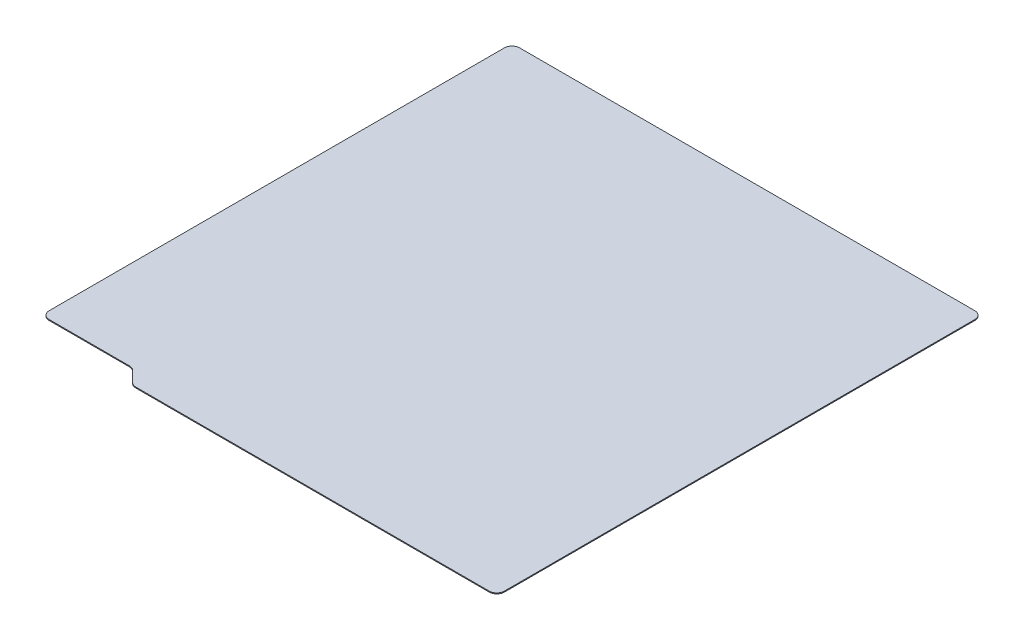
ISO-10303-21;
HEADER;
FILE_DESCRIPTION(('STEP AP214'),'2;1');
FILE_NAME('part.step','',(''),(''),'','','');
FILE_SCHEMA(('AUTOMOTIVE_DESIGN { 1 0 10303 214 1 1 1 1 }'));
ENDSEC;
DATA;
#1=APPLICATION_CONTEXT('core data for automotive mechanical design processes');
#2=APPLICATION_PROTOCOL_DEFINITION('international standard','automotive_design',2000,#1);
#3=PRODUCT_CONTEXT('',#1,'mechanical');
#4=PRODUCT('Part','Part','',(#3));
#5=PRODUCT_RELATED_PRODUCT_CATEGORY('part','',(#4));
#6=PRODUCT_DEFINITION_FORMATION('','',#4);
#7=PRODUCT_DEFINITION_CONTEXT('part definition',#1,'design');
#8=PRODUCT_DEFINITION('design','',#6,#7);
#9=PRODUCT_DEFINITION_SHAPE('','',#8);
#10=(LENGTH_UNIT() NAMED_UNIT(*) SI_UNIT(.MILLI.,.METRE.));
#11=(NAMED_UNIT(*) PLANE_ANGLE_UNIT() SI_UNIT($,.RADIAN.));
#12=(NAMED_UNIT(*) SI_UNIT($,.STERADIAN.) SOLID_ANGLE_UNIT());
#13=UNCERTAINTY_MEASURE_WITH_UNIT(LENGTH_MEASURE(1.E-05),#10,'distance_accuracy_value','');
#14=(GEOMETRIC_REPRESENTATION_CONTEXT(3) GLOBAL_UNCERTAINTY_ASSIGNED_CONTEXT((#13)) GLOBAL_UNIT_ASSIGNED_CONTEXT((#10,
#11,#12)) REPRESENTATION_CONTEXT('',''));
#15=CARTESIAN_POINT('',(0.,0.,0.));
#16=DIRECTION('',(0.,0.,1.));
#17=DIRECTION('',(1.,0.,0.));
#18=AXIS2_PLACEMENT_3D('',#15,#16,#17);
#19=CARTESIAN_POINT('',(-155.,0.6,155.));
#20=DIRECTION('',(1.,0.,0.));
#21=DIRECTION('',(0.,0.,-1.));
#22=AXIS2_PLACEMENT_3D('',#19,#20,#21);
#23=PLANE('',#22);
#24=DIRECTION('',(0.,0.,1.));
#25=VECTOR('',#24,1.);
#26=CARTESIAN_POINT('',(-155.,0.,155.));
#27=LINE('',#26,#25);
#28=CARTESIAN_POINT('',(-155.,0.,-150.));
#29=VERTEX_POINT('',#28);
#30=CARTESIAN_POINT('',(-155.,0.,150.));
#31=VERTEX_POINT('',#30);
#32=EDGE_CURVE('E192',#29,#31,#27,.T.);
#33=ORIENTED_EDGE('',*,*,#32,.T.);
#34=DIRECTION('',(0.,-1.,0.));
#35=VECTOR('',#34,1.);
#36=CARTESIAN_POINT('',(-155.,0.6,150.));
#37=LINE('',#36,#35);
#38=CARTESIAN_POINT('',(-155.,0.6,150.));
#39=VERTEX_POINT('',#38);
#40=EDGE_CURVE('E174',#31,#39,#37,.F.);
#41=ORIENTED_EDGE('',*,*,#40,.T.);
#42=DIRECTION('',(0.,0.,1.));
#43=VECTOR('',#42,1.);
#44=CARTESIAN_POINT('',(-155.,0.6,155.));
#45=LINE('',#44,#43);
#46=CARTESIAN_POINT('',(-155.,0.6,-150.));
#47=VERTEX_POINT('',#46);
#48=EDGE_CURVE('E135',#47,#39,#45,.T.);
#49=ORIENTED_EDGE('',*,*,#48,.F.);
#50=DIRECTION('',(0.,-1.,0.));
#51=VECTOR('',#50,1.);
#52=CARTESIAN_POINT('',(-155.,0.6,-150.));
#53=LINE('',#52,#51);
#54=EDGE_CURVE('E171',#47,#29,#53,.T.);
#55=ORIENTED_EDGE('',*,*,#54,.T.);
#56=EDGE_LOOP('',(#33,#41,#49,#55));
#57=FACE_BOUND('',#56,.T.);
#58=ADVANCED_FACE('F17',(#57),#23,.F.);
#59=CARTESIAN_POINT('',(-155.,0.6,155.));
#60=DIRECTION('',(0.,0.,-1.));
#61=DIRECTION('',(-1.,0.,0.));
#62=AXIS2_PLACEMENT_3D('',#59,#60,#61);
#63=PLANE('',#62);
#64=DIRECTION('',(1.,0.,0.));
#65=VECTOR('',#64,1.);
#66=CARTESIAN_POINT('',(-155.,0.,155.));
#67=LINE('',#66,#65);
#68=CARTESIAN_POINT('',(-150.,0.,155.));
#69=VERTEX_POINT('',#68);
#70=CARTESIAN_POINT('',(-97.0710678118654,0.,155.));
#71=VERTEX_POINT('',#70);
#72=EDGE_CURVE('E182',#69,#71,#67,.T.);
#73=ORIENTED_EDGE('',*,*,#72,.T.);
#74=DIRECTION('',(0.,-1.,0.));
#75=VECTOR('',#74,1.);
#76=CARTESIAN_POINT('',(-97.0710678118654,0.6,155.));
#77=LINE('',#76,#75);
#78=CARTESIAN_POINT('',(-97.0710678118654,0.6,155.));
#79=VERTEX_POINT('',#78);
#80=EDGE_CURVE('E169',#71,#79,#77,.F.);
#81=ORIENTED_EDGE('',*,*,#80,.T.);
#82=DIRECTION('',(1.,0.,0.));
#83=VECTOR('',#82,1.);
#84=CARTESIAN_POINT('',(-155.,0.6,155.));
#85=LINE('',#84,#83);
#86=CARTESIAN_POINT('',(-150.,0.6,155.));
#87=VERTEX_POINT('',#86);
#88=EDGE_CURVE('E202',#87,#79,#85,.T.);
#89=ORIENTED_EDGE('',*,*,#88,.F.);
#90=DIRECTION('',(0.,-1.,0.));
#91=VECTOR('',#90,1.);
#92=CARTESIAN_POINT('',(-150.,0.6,155.));
#93=LINE('',#92,#91);
#94=EDGE_CURVE('E166',#87,#69,#93,.T.);
#95=ORIENTED_EDGE('',*,*,#94,.T.);
#96=EDGE_LOOP('',(#73,#81,#89,#95));
#97=FACE_BOUND('',#96,.T.);
#98=ADVANCED_FACE('F188',(#97),#63,.F.);
#99=CARTESIAN_POINT('',(-95.,0.6,155.));
#100=DIRECTION('',(0.707106781186549,0.,-0.707106781186547));
#101=DIRECTION('',(-0.707106781186547,0.,-0.707106781186549));
#102=AXIS2_PLACEMENT_3D('',#99,#100,#101);
#103=PLANE('',#102);
#104=DIRECTION('',(0.707106781186547,0.,0.707106781186549));
#105=VECTOR('',#104,1.);
#106=CARTESIAN_POINT('',(-95.,0.,155.));
#107=LINE('',#106,#105);
#108=CARTESIAN_POINT('',(-93.5355339059327,0.,156.464466094067));
#109=VERTEX_POINT('',#108);
#110=CARTESIAN_POINT('',(-86.4644660940672,0.,163.535533905933));
#111=VERTEX_POINT('',#110);
#112=EDGE_CURVE('E137',#109,#111,#107,.T.);
#113=ORIENTED_EDGE('',*,*,#112,.T.);
#114=DIRECTION('',(0.,-1.,0.));
#115=VECTOR('',#114,1.);
#116=CARTESIAN_POINT('',(-86.4644660940672,0.6,163.535533905933));
#117=LINE('',#116,#115);
#118=CARTESIAN_POINT('',(-86.4644660940672,0.6,163.535533905933));
#119=VERTEX_POINT('',#118);
#120=EDGE_CURVE('E164',#111,#119,#117,.F.);
#121=ORIENTED_EDGE('',*,*,#120,.T.);
#122=DIRECTION('',(0.707106781186547,0.,0.707106781186549));
#123=VECTOR('',#122,1.);
#124=CARTESIAN_POINT('',(-95.,0.6,155.));
#125=LINE('',#124,#123);
#126=CARTESIAN_POINT('',(-93.5355339059327,0.6,156.464466094067));
#127=VERTEX_POINT('',#126);
#128=EDGE_CURVE('E200',#127,#119,#125,.T.);
#129=ORIENTED_EDGE('',*,*,#128,.F.);
#130=DIRECTION('',(0.,-1.,0.));
#131=VECTOR('',#130,1.);
#132=CARTESIAN_POINT('',(-93.5355339059327,0.,156.464466094067));
#133=LINE('',#132,#131);
#134=EDGE_CURVE('E161',#127,#109,#133,.T.);
#135=ORIENTED_EDGE('',*,*,#134,.T.);
#136=EDGE_LOOP('',(#113,#121,#129,#135));
#137=FACE_BOUND('',#136,.T.);
#138=ADVANCED_FACE('F204',(#137),#103,.F.);
#139=CARTESIAN_POINT('',(-85.,0.6,165.));
#140=DIRECTION('',(0.,0.,-1.));
#141=DIRECTION('',(-1.,0.,0.));
#142=AXIS2_PLACEMENT_3D('',#139,#140,#141);
#143=PLANE('',#142);
#144=DIRECTION('',(1.,0.,0.));
#145=VECTOR('',#144,1.);
#146=CARTESIAN_POINT('',(-85.,0.,165.));
#147=LINE('',#146,#145);
#148=CARTESIAN_POINT('',(-82.9289321881345,0.,165.));
#149=VERTEX_POINT('',#148);
#150=CARTESIAN_POINT('',(150.,0.,165.));
#151=VERTEX_POINT('',#150);
#152=EDGE_CURVE('E133',#149,#151,#147,.T.);
#153=ORIENTED_EDGE('',*,*,#152,.T.);
#154=DIRECTION('',(0.,-1.,0.));
#155=VECTOR('',#154,1.);
#156=CARTESIAN_POINT('',(150.,0.6,165.));
#157=LINE('',#156,#155);
#158=CARTESIAN_POINT('',(150.,0.6,165.));
#159=VERTEX_POINT('',#158);
#160=EDGE_CURVE('E112',#151,#159,#157,.F.);
#161=ORIENTED_EDGE('',*,*,#160,.T.);
#162=DIRECTION('',(1.,0.,0.));
#163=VECTOR('',#162,1.);
#164=CARTESIAN_POINT('',(-85.,0.6,165.));
#165=LINE('',#164,#163);
#166=CARTESIAN_POINT('',(-82.9289321881345,0.6,165.));
#167=VERTEX_POINT('',#166);
#168=EDGE_CURVE('E206',#167,#159,#165,.T.);
#169=ORIENTED_EDGE('',*,*,#168,.F.);
#170=DIRECTION('',(0.,-1.,0.));
#171=VECTOR('',#170,1.);
#172=CARTESIAN_POINT('',(-82.9289321881345,0.6,165.));
#173=LINE('',#172,#171);
#174=EDGE_CURVE('E117',#167,#149,#173,.T.);
#175=ORIENTED_EDGE('',*,*,#174,.T.);
#176=EDGE_LOOP('',(#153,#161,#169,#175));
#177=FACE_BOUND('',#176,.T.);
#178=ADVANCED_FACE('F220',(#177),#143,.F.);
#179=CARTESIAN_POINT('',(155.,0.6,155.));
#180=DIRECTION('',(-1.,0.,0.));
#181=DIRECTION('',(0.,0.,1.));
#182=AXIS2_PLACEMENT_3D('',#179,#180,#181);
#183=PLANE('',#182);
#184=DIRECTION('',(0.,0.,-1.));
#185=VECTOR('',#184,1.);
#186=CARTESIAN_POINT('',(155.,0.6,165.));
#187=LINE('',#186,#185);
#188=CARTESIAN_POINT('',(155.,0.6,160.));
#189=VERTEX_POINT('',#188);
#190=CARTESIAN_POINT('',(155.,0.6,-150.));
#191=VERTEX_POINT('',#190);
#192=EDGE_CURVE('E126',#189,#191,#187,.T.);
#193=ORIENTED_EDGE('',*,*,#192,.F.);
#194=DIRECTION('',(0.,-1.,0.));
#195=VECTOR('',#194,1.);
#196=CARTESIAN_POINT('',(155.,0.6,160.));
#197=LINE('',#196,#195);
#198=CARTESIAN_POINT('',(155.,0.,160.));
#199=VERTEX_POINT('',#198);
#200=EDGE_CURVE('E111',#189,#199,#197,.T.);
#201=ORIENTED_EDGE('',*,*,#200,.T.);
#202=DIRECTION('',(0.,0.,-1.));
#203=VECTOR('',#202,1.);
#204=CARTESIAN_POINT('',(155.,0.,155.));
#205=LINE('',#204,#203);
#206=CARTESIAN_POINT('',(155.,0.,-150.));
#207=VERTEX_POINT('',#206);
#208=EDGE_CURVE('E124',#199,#207,#205,.T.);
#209=ORIENTED_EDGE('',*,*,#208,.T.);
#210=DIRECTION('',(0.,-1.,0.));
#211=VECTOR('',#210,1.);
#212=CARTESIAN_POINT('',(155.,0.6,-150.));
#213=LINE('',#212,#211);
#214=EDGE_CURVE('E128',#207,#191,#213,.F.);
#215=ORIENTED_EDGE('',*,*,#214,.T.);
#216=EDGE_LOOP('',(#193,#201,#209,#215));
#217=FACE_BOUND('',#216,.T.);
#218=ADVANCED_FACE('F123',(#217),#183,.F.);
#219=CARTESIAN_POINT('',(155.,0.6,-155.));
#220=DIRECTION('',(0.,0.,1.));
#221=DIRECTION('',(1.,0.,0.));
#222=AXIS2_PLACEMENT_3D('',#219,#220,#221);
#223=PLANE('',#222);
#224=DIRECTION('',(-1.,0.,0.));
#225=VECTOR('',#224,1.);
#226=CARTESIAN_POINT('',(155.,0.,-155.));
#227=LINE('',#226,#225);
#228=CARTESIAN_POINT('',(150.,0.,-155.));
#229=VERTEX_POINT('',#228);
#230=CARTESIAN_POINT('',(-150.,0.,-155.));
#231=VERTEX_POINT('',#230);
#232=EDGE_CURVE('E132',#229,#231,#227,.T.);
#233=ORIENTED_EDGE('',*,*,#232,.T.);
#234=DIRECTION('',(0.,-1.,0.));
#235=VECTOR('',#234,1.);
#236=CARTESIAN_POINT('',(-150.,0.6,-155.));
#237=LINE('',#236,#235);
#238=CARTESIAN_POINT('',(-150.,0.6,-155.));
#239=VERTEX_POINT('',#238);
#240=EDGE_CURVE('E32',#231,#239,#237,.F.);
#241=ORIENTED_EDGE('',*,*,#240,.T.);
#242=DIRECTION('',(-1.,0.,0.));
#243=VECTOR('',#242,1.);
#244=CARTESIAN_POINT('',(155.,0.6,-155.));
#245=LINE('',#244,#243);
#246=CARTESIAN_POINT('',(150.,0.6,-155.));
#247=VERTEX_POINT('',#246);
#248=EDGE_CURVE('E141',#247,#239,#245,.T.);
#249=ORIENTED_EDGE('',*,*,#248,.F.);
#250=DIRECTION('',(0.,-1.,0.));
#251=VECTOR('',#250,1.);
#252=CARTESIAN_POINT('',(150.,0.6,-155.));
#253=LINE('',#252,#251);
#254=EDGE_CURVE('E176',#247,#229,#253,.T.);
#255=ORIENTED_EDGE('',*,*,#254,.T.);
#256=EDGE_LOOP('',(#233,#241,#249,#255));
#257=FACE_BOUND('',#256,.T.);
#258=ADVANCED_FACE('F229',(#257),#223,.F.);
#259=CARTESIAN_POINT('',(0.,0.6,0.));
#260=DIRECTION('',(0.,1.,0.));
#261=DIRECTION('',(0.,0.,1.));
#262=AXIS2_PLACEMENT_3D('',#259,#260,#261);
#263=PLANE('',#262);
#264=ORIENTED_EDGE('',*,*,#168,.T.);
#265=CARTESIAN_POINT('',(150.,0.6,160.));
#266=DIRECTION('',(0.,1.,0.));
#267=DIRECTION('',(0.,0.,1.));
#268=AXIS2_PLACEMENT_3D('',#265,#266,#267);
#269=CIRCLE('',#268,5.);
#270=EDGE_CURVE('E159',#159,#189,#269,.T.);
#271=ORIENTED_EDGE('',*,*,#270,.T.);
#272=ORIENTED_EDGE('',*,*,#192,.T.);
#273=CARTESIAN_POINT('',(150.,0.6,-150.));
#274=DIRECTION('',(0.,1.,0.));
#275=DIRECTION('',(0.,0.,1.));
#276=AXIS2_PLACEMENT_3D('',#273,#274,#275);
#277=CIRCLE('',#276,5.);
#278=EDGE_CURVE('E39',#191,#247,#277,.T.);
#279=ORIENTED_EDGE('',*,*,#278,.T.);
#280=ORIENTED_EDGE('',*,*,#248,.T.);
#281=CARTESIAN_POINT('',(-150.,0.6,-150.));
#282=DIRECTION('',(0.,1.,0.));
#283=DIRECTION('',(0.,0.,1.));
#284=AXIS2_PLACEMENT_3D('',#281,#282,#283);
#285=CIRCLE('',#284,5.);
#286=EDGE_CURVE('E153',#239,#47,#285,.T.);
#287=ORIENTED_EDGE('',*,*,#286,.T.);
#288=ORIENTED_EDGE('',*,*,#48,.T.);
#289=CARTESIAN_POINT('',(-150.,0.6,150.));
#290=DIRECTION('',(0.,1.,0.));
#291=DIRECTION('',(0.,0.,1.));
#292=AXIS2_PLACEMENT_3D('',#289,#290,#291);
#293=CIRCLE('',#292,5.);
#294=EDGE_CURVE('E155',#39,#87,#293,.T.);
#295=ORIENTED_EDGE('',*,*,#294,.T.);
#296=ORIENTED_EDGE('',*,*,#88,.T.);
#297=CARTESIAN_POINT('',(-97.0710678118654,0.6,160.));
#298=DIRECTION('',(0.,1.,0.));
#299=DIRECTION('',(0.,0.,1.));
#300=AXIS2_PLACEMENT_3D('',#297,#298,#299);
#301=CIRCLE('',#300,5.);
#302=EDGE_CURVE('E11',#79,#127,#301,.F.);
#303=ORIENTED_EDGE('',*,*,#302,.T.);
#304=ORIENTED_EDGE('',*,*,#128,.T.);
#305=CARTESIAN_POINT('',(-82.9289321881345,0.6,160.));
#306=DIRECTION('',(0.,1.,0.));
#307=DIRECTION('',(0.,0.,1.));
#308=AXIS2_PLACEMENT_3D('',#305,#306,#307);
#309=CIRCLE('',#308,5.);
#310=EDGE_CURVE('E157',#119,#167,#309,.T.);
#311=ORIENTED_EDGE('',*,*,#310,.T.);
#312=EDGE_LOOP('',(#264,#271,#272,#279,#280,#287,#288,#295,#296,#303,#304,#311));
#313=FACE_BOUND('',#312,.T.);
#314=ADVANCED_FACE('F199',(#313),#263,.T.);
#315=CARTESIAN_POINT('',(0.,0.,0.));
#316=DIRECTION('',(0.,1.,0.));
#317=DIRECTION('',(0.,0.,1.));
#318=AXIS2_PLACEMENT_3D('',#315,#316,#317);
#319=PLANE('',#318);
#320=ORIENTED_EDGE('',*,*,#208,.F.);
#321=CARTESIAN_POINT('',(150.,0.,160.));
#322=DIRECTION('',(0.,1.,0.));
#323=DIRECTION('',(0.,0.,1.));
#324=AXIS2_PLACEMENT_3D('',#321,#322,#323);
#325=CIRCLE('',#324,5.);
#326=EDGE_CURVE('E107',#199,#151,#325,.F.);
#327=ORIENTED_EDGE('',*,*,#326,.T.);
#328=ORIENTED_EDGE('',*,*,#152,.F.);
#329=CARTESIAN_POINT('',(-82.9289321881345,0.,160.));
#330=DIRECTION('',(0.,1.,0.));
#331=DIRECTION('',(0.,0.,1.));
#332=AXIS2_PLACEMENT_3D('',#329,#330,#331);
#333=CIRCLE('',#332,5.);
#334=EDGE_CURVE('E118',#149,#111,#333,.F.);
#335=ORIENTED_EDGE('',*,*,#334,.T.);
#336=ORIENTED_EDGE('',*,*,#112,.F.);
#337=CARTESIAN_POINT('',(-97.0710678118654,0.,160.));
#338=DIRECTION('',(0.,1.,0.));
#339=DIRECTION('',(0.,0.,1.));
#340=AXIS2_PLACEMENT_3D('',#337,#338,#339);
#341=CIRCLE('',#340,5.);
#342=EDGE_CURVE('E25',#109,#71,#341,.T.);
#343=ORIENTED_EDGE('',*,*,#342,.T.);
#344=ORIENTED_EDGE('',*,*,#72,.F.);
#345=CARTESIAN_POINT('',(-150.,0.,150.));
#346=DIRECTION('',(0.,1.,0.));
#347=DIRECTION('',(0.,0.,1.));
#348=AXIS2_PLACEMENT_3D('',#345,#346,#347);
#349=CIRCLE('',#348,5.);
#350=EDGE_CURVE('E146',#69,#31,#349,.F.);
#351=ORIENTED_EDGE('',*,*,#350,.T.);
#352=ORIENTED_EDGE('',*,*,#32,.F.);
#353=CARTESIAN_POINT('',(-150.,0.,-150.));
#354=DIRECTION('',(0.,1.,0.));
#355=DIRECTION('',(0.,0.,1.));
#356=AXIS2_PLACEMENT_3D('',#353,#354,#355);
#357=CIRCLE('',#356,5.);
#358=EDGE_CURVE('E144',#29,#231,#357,.F.);
#359=ORIENTED_EDGE('',*,*,#358,.T.);
#360=ORIENTED_EDGE('',*,*,#232,.F.);
#361=CARTESIAN_POINT('',(150.,0.,-150.));
#362=DIRECTION('',(0.,1.,0.));
#363=DIRECTION('',(0.,0.,1.));
#364=AXIS2_PLACEMENT_3D('',#361,#362,#363);
#365=CIRCLE('',#364,5.);
#366=EDGE_CURVE('E127',#229,#207,#365,.F.);
#367=ORIENTED_EDGE('',*,*,#366,.T.);
#368=EDGE_LOOP('',(#320,#327,#328,#335,#336,#343,#344,#351,#352,#359,#360,#367));
#369=FACE_BOUND('',#368,.T.);
#370=ADVANCED_FACE('F130',(#369),#319,.F.);
#371=CARTESIAN_POINT('',(150.,0.6,160.));
#372=DIRECTION('',(0.,-1.,0.));
#373=DIRECTION('',(0.,0.,-1.));
#374=AXIS2_PLACEMENT_3D('',#371,#372,#373);
#375=CYLINDRICAL_SURFACE('',#374,5.);
#376=ORIENTED_EDGE('',*,*,#270,.F.);
#377=ORIENTED_EDGE('',*,*,#160,.F.);
#378=ORIENTED_EDGE('',*,*,#326,.F.);
#379=ORIENTED_EDGE('',*,*,#200,.F.);
#380=EDGE_LOOP('',(#376,#377,#378,#379));
#381=FACE_BOUND('',#380,.T.);
#382=ADVANCED_FACE('F110',(#381),#375,.T.);
#383=CARTESIAN_POINT('',(-82.9289321881345,0.6,160.));
#384=DIRECTION('',(0.,-1.,0.));
#385=DIRECTION('',(0.,0.,-1.));
#386=AXIS2_PLACEMENT_3D('',#383,#384,#385);
#387=CYLINDRICAL_SURFACE('',#386,5.);
#388=ORIENTED_EDGE('',*,*,#310,.F.);
#389=ORIENTED_EDGE('',*,*,#120,.F.);
#390=ORIENTED_EDGE('',*,*,#334,.F.);
#391=ORIENTED_EDGE('',*,*,#174,.F.);
#392=EDGE_LOOP('',(#388,#389,#390,#391));
#393=FACE_BOUND('',#392,.T.);
#394=ADVANCED_FACE('F216',(#393),#387,.T.);
#395=CARTESIAN_POINT('',(-97.0710678118654,0.6,160.));
#396=DIRECTION('',(0.,1.,0.));
#397=DIRECTION('',(0.,0.,1.));
#398=AXIS2_PLACEMENT_3D('',#395,#396,#397);
#399=CYLINDRICAL_SURFACE('',#398,5.);
#400=ORIENTED_EDGE('',*,*,#302,.F.);
#401=ORIENTED_EDGE('',*,*,#80,.F.);
#402=ORIENTED_EDGE('',*,*,#342,.F.);
#403=ORIENTED_EDGE('',*,*,#134,.F.);
#404=EDGE_LOOP('',(#400,#401,#402,#403));
#405=FACE_BOUND('',#404,.T.);
#406=ADVANCED_FACE('F195',(#405),#399,.F.);
#407=CARTESIAN_POINT('',(-150.,0.6,150.));
#408=DIRECTION('',(0.,-1.,0.));
#409=DIRECTION('',(0.,0.,-1.));
#410=AXIS2_PLACEMENT_3D('',#407,#408,#409);
#411=CYLINDRICAL_SURFACE('',#410,5.);
#412=ORIENTED_EDGE('',*,*,#294,.F.);
#413=ORIENTED_EDGE('',*,*,#40,.F.);
#414=ORIENTED_EDGE('',*,*,#350,.F.);
#415=ORIENTED_EDGE('',*,*,#94,.F.);
#416=EDGE_LOOP('',(#412,#413,#414,#415));
#417=FACE_BOUND('',#416,.T.);
#418=ADVANCED_FACE('F247',(#417),#411,.T.);
#419=CARTESIAN_POINT('',(-150.,0.6,-150.));
#420=DIRECTION('',(0.,-1.,0.));
#421=DIRECTION('',(0.,0.,-1.));
#422=AXIS2_PLACEMENT_3D('',#419,#420,#421);
#423=CYLINDRICAL_SURFACE('',#422,5.);
#424=ORIENTED_EDGE('',*,*,#286,.F.);
#425=ORIENTED_EDGE('',*,*,#240,.F.);
#426=ORIENTED_EDGE('',*,*,#358,.F.);
#427=ORIENTED_EDGE('',*,*,#54,.F.);
#428=EDGE_LOOP('',(#424,#425,#426,#427));
#429=FACE_BOUND('',#428,.T.);
#430=ADVANCED_FACE('F249',(#429),#423,.T.);
#431=CARTESIAN_POINT('',(150.,0.6,-150.));
#432=DIRECTION('',(0.,-1.,0.));
#433=DIRECTION('',(0.,0.,-1.));
#434=AXIS2_PLACEMENT_3D('',#431,#432,#433);
#435=CYLINDRICAL_SURFACE('',#434,5.);
#436=ORIENTED_EDGE('',*,*,#278,.F.);
#437=ORIENTED_EDGE('',*,*,#214,.F.);
#438=ORIENTED_EDGE('',*,*,#366,.F.);
#439=ORIENTED_EDGE('',*,*,#254,.F.);
#440=EDGE_LOOP('',(#436,#437,#438,#439));
#441=FACE_BOUND('',#440,.T.);
#442=ADVANCED_FACE('F19',(#441),#435,.T.);
#443=CLOSED_SHELL('',(#58,#98,#138,#178,#218,#258,#314,#370,#382,#394,#406,#418,#430,#442));
#444=MANIFOLD_SOLID_BREP('B1',#443);
#445=ADVANCED_BREP_SHAPE_REPRESENTATION('',(#18,#444),#14);
#446=SHAPE_DEFINITION_REPRESENTATION(#9,#445);
ENDSEC;
END-ISO-10303-21;
